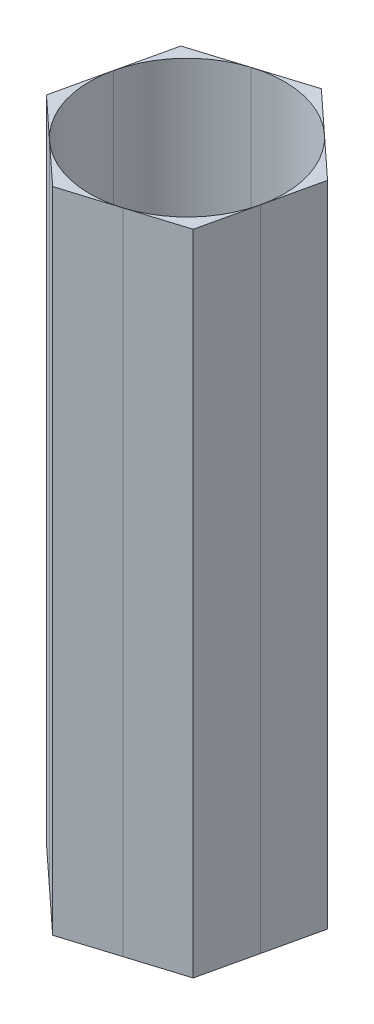
ISO-10303-21;
HEADER;
FILE_DESCRIPTION(('STEP AP214'),'2;1');
FILE_NAME('part.step','',(''),(''),'','','');
FILE_SCHEMA(('AUTOMOTIVE_DESIGN { 1 0 10303 214 1 1 1 1 }'));
ENDSEC;
DATA;
#1=APPLICATION_CONTEXT('core data for automotive mechanical design processes');
#2=APPLICATION_PROTOCOL_DEFINITION('international standard','automotive_design',2000,#1);
#3=PRODUCT_CONTEXT('',#1,'mechanical');
#4=PRODUCT('Part','Part','',(#3));
#5=PRODUCT_RELATED_PRODUCT_CATEGORY('part','',(#4));
#6=PRODUCT_DEFINITION_FORMATION('','',#4);
#7=PRODUCT_DEFINITION_CONTEXT('part definition',#1,'design');
#8=PRODUCT_DEFINITION('design','',#6,#7);
#9=PRODUCT_DEFINITION_SHAPE('','',#8);
#10=(LENGTH_UNIT() NAMED_UNIT(*) SI_UNIT(.MILLI.,.METRE.));
#11=(NAMED_UNIT(*) PLANE_ANGLE_UNIT() SI_UNIT($,.RADIAN.));
#12=(NAMED_UNIT(*) SI_UNIT($,.STERADIAN.) SOLID_ANGLE_UNIT());
#13=UNCERTAINTY_MEASURE_WITH_UNIT(LENGTH_MEASURE(1.E-05),#10,'distance_accuracy_value','');
#14=(GEOMETRIC_REPRESENTATION_CONTEXT(3) GLOBAL_UNCERTAINTY_ASSIGNED_CONTEXT((#13)) GLOBAL_UNIT_ASSIGNED_CONTEXT((#10,
#11,#12)) REPRESENTATION_CONTEXT('',''));
#15=CARTESIAN_POINT('',(0.,0.,0.));
#16=DIRECTION('',(0.,0.,1.));
#17=DIRECTION('',(1.,0.,0.));
#18=AXIS2_PLACEMENT_3D('',#15,#16,#17);
#19=CARTESIAN_POINT('',(-0.382700189937458,10.,1.68924260087823));
#20=DIRECTION('',(-0.296292240203085,0.,-0.955097329278769));
#21=DIRECTION('',(-0.955097329278769,0.,0.296292240203085));
#22=AXIS2_PLACEMENT_3D('',#19,#20,#21);
#23=PLANE('',#22);
#24=DIRECTION('',(0.,1.,0.));
#25=VECTOR('',#24,1.);
#26=CARTESIAN_POINT('',(0.444438782125141,-25.,1.43264735365557));
#27=LINE('',#26,#25);
#28=CARTESIAN_POINT('',(0.44443836030463,0.,1.43264599391816));
#29=VERTEX_POINT('',#28);
#30=CARTESIAN_POINT('',(0.444439203945652,10.,1.43264871339298));
#31=VERTEX_POINT('',#30);
#32=EDGE_CURVE('E54',#29,#31,#27,.T.);
#33=ORIENTED_EDGE('',*,*,#32,.F.);
#34=DIRECTION('',(0.955097329278769,0.,-0.296292240203085));
#35=VECTOR('',#34,1.);
#36=CARTESIAN_POINT('',(-0.382700189937458,0.,1.68924260087823));
#37=LINE('',#36,#35);
#38=CARTESIAN_POINT('',(1.27157691054672,0.,1.17604938695809));
#39=VERTEX_POINT('',#38);
#40=EDGE_CURVE('E92',#29,#39,#37,.T.);
#41=ORIENTED_EDGE('',*,*,#40,.T.);
#42=DIRECTION('',(0.,-1.,0.));
#43=VECTOR('',#42,1.);
#44=CARTESIAN_POINT('',(1.27157691054672,10.,1.17604938695809));
#45=LINE('',#44,#43);
#46=CARTESIAN_POINT('',(1.27157691054672,10.,1.17604938695809));
#47=VERTEX_POINT('',#46);
#48=EDGE_CURVE('E88',#47,#39,#45,.T.);
#49=ORIENTED_EDGE('',*,*,#48,.F.);
#50=DIRECTION('',(0.955097329278769,0.,-0.296292240203085));
#51=VECTOR('',#50,1.);
#52=CARTESIAN_POINT('',(-0.382700189937458,10.,1.68924260087823));
#53=LINE('',#52,#51);
#54=EDGE_CURVE('E48',#31,#47,#53,.T.);
#55=ORIENTED_EDGE('',*,*,#54,.F.);
#56=EDGE_LOOP('',(#33,#41,#49,#55));
#57=FACE_BOUND('',#56,.T.);
#58=ADVANCED_FACE('F44',(#57),#23,.F.);
#59=CARTESIAN_POINT('',(0.,10.,0.));
#60=DIRECTION('',(0.,1.,0.));
#61=DIRECTION('',(0.,0.,1.));
#62=AXIS2_PLACEMENT_3D('',#59,#60,#61);
#63=PLANE('',#62);
#64=CARTESIAN_POINT('',(0.,10.,0.));
#65=DIRECTION('',(0.,1.,0.));
#66=DIRECTION('',(0.,0.,1.));
#67=AXIS2_PLACEMENT_3D('',#64,#65,#66);
#68=CIRCLE('',#67,1.50000284732744);
#69=CARTESIAN_POINT('',(1.46292978247024,10.,0.331428715641823));
#70=VERTEX_POINT('',#69);
#71=EDGE_CURVE('E12',#31,#70,#68,.T.);
#72=ORIENTED_EDGE('',*,*,#71,.F.);
#73=ORIENTED_EDGE('',*,*,#54,.T.);
#74=DIRECTION('',(0.220952057679312,0.,-0.975284670343627));
#75=VECTOR('',#74,1.);
#76=CARTESIAN_POINT('',(1.27157691054672,10.,1.17604938695809));
#77=LINE('',#76,#75);
#78=EDGE_CURVE('E84',#47,#70,#77,.T.);
#79=ORIENTED_EDGE('',*,*,#78,.T.);
#80=EDGE_LOOP('',(#72,#73,#79));
#81=FACE_BOUND('',#80,.T.);
#82=ADVANCED_FACE('F90',(#81),#63,.T.);
#83=CARTESIAN_POINT('',(0.,0.,0.));
#84=DIRECTION('',(0.,1.,0.));
#85=DIRECTION('',(0.,0.,1.));
#86=AXIS2_PLACEMENT_3D('',#83,#84,#85);
#87=PLANE('',#86);
#88=ORIENTED_EDGE('',*,*,#40,.F.);
#89=CARTESIAN_POINT('',(0.,0.,0.));
#90=DIRECTION('',(0.,1.,0.));
#91=DIRECTION('',(0.,0.,1.));
#92=AXIS2_PLACEMENT_3D('',#89,#90,#91);
#93=CIRCLE('',#92,1.50000284732744);
#94=CARTESIAN_POINT('',(1.46292700551545,0.,0.331428086518969));
#95=VERTEX_POINT('',#94);
#96=EDGE_CURVE('E62',#29,#95,#93,.T.);
#97=ORIENTED_EDGE('',*,*,#96,.T.);
#98=DIRECTION('',(0.220952057679312,0.,-0.975284670343627));
#99=VECTOR('',#98,1.);
#100=CARTESIAN_POINT('',(1.27157691054672,0.,1.17604938695809));
#101=LINE('',#100,#99);
#102=EDGE_CURVE('E87',#39,#95,#101,.T.);
#103=ORIENTED_EDGE('',*,*,#102,.F.);
#104=EDGE_LOOP('',(#88,#97,#103));
#105=FACE_BOUND('',#104,.T.);
#106=ADVANCED_FACE('F100',(#105),#87,.F.);
#107=CARTESIAN_POINT('',(1.27157691054672,10.,1.17604938695809));
#108=DIRECTION('',(-0.975284670343628,0.,-0.220952057679312));
#109=DIRECTION('',(-0.220952057679312,0.,0.975284670343628));
#110=AXIS2_PLACEMENT_3D('',#107,#108,#109);
#111=PLANE('',#110);
#112=ORIENTED_EDGE('',*,*,#102,.T.);
#113=DIRECTION('',(0.,1.,0.));
#114=VECTOR('',#113,1.);
#115=CARTESIAN_POINT('',(1.46292839399284,-25.,0.331428401080396));
#116=LINE('',#115,#114);
#117=EDGE_CURVE('E76',#95,#70,#116,.T.);
#118=ORIENTED_EDGE('',*,*,#117,.T.);
#119=ORIENTED_EDGE('',*,*,#78,.F.);
#120=ORIENTED_EDGE('',*,*,#48,.T.);
#121=EDGE_LOOP('',(#112,#118,#119,#120));
#122=FACE_BOUND('',#121,.T.);
#123=ADVANCED_FACE('F82',(#122),#111,.F.);
#124=CARTESIAN_POINT('',(0.,-25.,0.));
#125=DIRECTION('',(0.,1.,0.));
#126=DIRECTION('',(0.,0.,1.));
#127=AXIS2_PLACEMENT_3D('',#124,#125,#126);
#128=CYLINDRICAL_SURFACE('',#127,1.50000284732744);
#129=ORIENTED_EDGE('',*,*,#32,.T.);
#130=ORIENTED_EDGE('',*,*,#71,.T.);
#131=ORIENTED_EDGE('',*,*,#117,.F.);
#132=ORIENTED_EDGE('',*,*,#96,.F.);
#133=EDGE_LOOP('',(#129,#130,#131,#132));
#134=FACE_BOUND('',#133,.T.);
#135=ADVANCED_FACE('F46',(#134),#128,.F.);
#136=CLOSED_SHELL('',(#58,#82,#106,#123,#135));
#137=MANIFOLD_SOLID_BREP('B2',#136);
#138=CARTESIAN_POINT('',(0.,10.,0.));
#139=DIRECTION('',(0.,1.,0.));
#140=DIRECTION('',(0.,0.,1.));
#141=AXIS2_PLACEMENT_3D('',#138,#139,#140);
#142=PLANE('',#141);
#143=CARTESIAN_POINT('',(0.,10.,0.));
#144=DIRECTION('',(0.,1.,0.));
#145=DIRECTION('',(0.,0.,1.));
#146=AXIS2_PLACEMENT_3D('',#143,#144,#145);
#147=CIRCLE('',#146,1.50000284732744);
#148=CARTESIAN_POINT('',(-1.01849057852459,10.,1.10121999775116));
#149=VERTEX_POINT('',#148);
#150=CARTESIAN_POINT('',(0.444439203945652,10.,1.43264871339298));
#151=VERTEX_POINT('',#150);
#152=EDGE_CURVE('E42',#149,#151,#147,.T.);
#153=ORIENTED_EDGE('',*,*,#152,.F.);
#154=DIRECTION('',(0.734145271599457,0.,0.678992430140542));
#155=VECTOR('',#154,1.);
#156=CARTESIAN_POINT('',(-1.65427710048418,10.,0.513193213920148));
#157=LINE('',#156,#155);
#158=CARTESIAN_POINT('',(-0.382700189937458,10.,1.68924260087823));
#159=VERTEX_POINT('',#158);
#160=EDGE_CURVE('E194',#149,#159,#157,.T.);
#161=ORIENTED_EDGE('',*,*,#160,.T.);
#162=DIRECTION('',(0.955097329278769,0.,-0.296292240203085));
#163=VECTOR('',#162,1.);
#164=CARTESIAN_POINT('',(-0.382700189937458,10.,1.68924260087823));
#165=LINE('',#164,#163);
#166=EDGE_CURVE('E190',#159,#151,#165,.T.);
#167=ORIENTED_EDGE('',*,*,#166,.T.);
#168=EDGE_LOOP('',(#153,#161,#167));
#169=FACE_BOUND('',#168,.T.);
#170=ADVANCED_FACE('F152',(#169),#142,.T.);
#171=CARTESIAN_POINT('',(0.,0.,0.));
#172=DIRECTION('',(0.,1.,0.));
#173=DIRECTION('',(0.,0.,1.));
#174=AXIS2_PLACEMENT_3D('',#171,#172,#173);
#175=PLANE('',#174);
#176=DIRECTION('',(0.734145271599457,0.,0.678992430140542));
#177=VECTOR('',#176,1.);
#178=CARTESIAN_POINT('',(-1.65427710048418,0.,0.513193213920148));
#179=LINE('',#178,#177);
#180=CARTESIAN_POINT('',(-1.01848864521082,0.,1.10121790739919));
#181=VERTEX_POINT('',#180);
#182=CARTESIAN_POINT('',(-0.382700189937458,0.,1.68924260087823));
#183=VERTEX_POINT('',#182);
#184=EDGE_CURVE('E197',#181,#183,#179,.T.);
#185=ORIENTED_EDGE('',*,*,#184,.F.);
#186=CARTESIAN_POINT('',(0.,0.,0.));
#187=DIRECTION('',(0.,1.,0.));
#188=DIRECTION('',(0.,0.,1.));
#189=AXIS2_PLACEMENT_3D('',#186,#187,#188);
#190=CIRCLE('',#189,1.50000284732744);
#191=CARTESIAN_POINT('',(0.44443836030463,0.,1.43264599391816));
#192=VERTEX_POINT('',#191);
#193=EDGE_CURVE('E169',#181,#192,#190,.T.);
#194=ORIENTED_EDGE('',*,*,#193,.T.);
#195=DIRECTION('',(0.955097329278769,0.,-0.296292240203085));
#196=VECTOR('',#195,1.);
#197=CARTESIAN_POINT('',(-0.382700189937458,0.,1.68924260087823));
#198=LINE('',#197,#196);
#199=EDGE_CURVE('E192',#183,#192,#198,.T.);
#200=ORIENTED_EDGE('',*,*,#199,.F.);
#201=EDGE_LOOP('',(#185,#194,#200));
#202=FACE_BOUND('',#201,.T.);
#203=ADVANCED_FACE('F208',(#202),#175,.F.);
#204=CARTESIAN_POINT('',(-1.65427710048418,10.,0.513193213920148));
#205=DIRECTION('',(0.678992430140542,0.,-0.734145271599457));
#206=DIRECTION('',(-0.734145271599457,0.,-0.678992430140542));
#207=AXIS2_PLACEMENT_3D('',#204,#205,#206);
#208=PLANE('',#207);
#209=DIRECTION('',(0.,1.,0.));
#210=VECTOR('',#209,1.);
#211=CARTESIAN_POINT('',(-1.0184896118677,-25.,1.10121895257517));
#212=LINE('',#211,#210);
#213=EDGE_CURVE('E162',#181,#149,#212,.T.);
#214=ORIENTED_EDGE('',*,*,#213,.F.);
#215=ORIENTED_EDGE('',*,*,#184,.T.);
#216=DIRECTION('',(0.,-1.,0.));
#217=VECTOR('',#216,1.);
#218=CARTESIAN_POINT('',(-0.382700189937458,10.,1.68924260087823));
#219=LINE('',#218,#217);
#220=EDGE_CURVE('E193',#159,#183,#219,.T.);
#221=ORIENTED_EDGE('',*,*,#220,.F.);
#222=ORIENTED_EDGE('',*,*,#160,.F.);
#223=EDGE_LOOP('',(#214,#215,#221,#222));
#224=FACE_BOUND('',#223,.T.);
#225=ADVANCED_FACE('F206',(#224),#208,.F.);
#226=CARTESIAN_POINT('',(-0.382700189937458,10.,1.68924260087823));
#227=DIRECTION('',(-0.296292240203085,0.,-0.955097329278769));
#228=DIRECTION('',(-0.955097329278769,0.,0.296292240203085));
#229=AXIS2_PLACEMENT_3D('',#226,#227,#228);
#230=PLANE('',#229);
#231=ORIENTED_EDGE('',*,*,#199,.T.);
#232=DIRECTION('',(0.,1.,0.));
#233=VECTOR('',#232,1.);
#234=CARTESIAN_POINT('',(0.444438782125141,-25.,1.43264735365557));
#235=LINE('',#234,#233);
#236=EDGE_CURVE('E156',#192,#151,#235,.T.);
#237=ORIENTED_EDGE('',*,*,#236,.T.);
#238=ORIENTED_EDGE('',*,*,#166,.F.);
#239=ORIENTED_EDGE('',*,*,#220,.T.);
#240=EDGE_LOOP('',(#231,#237,#238,#239));
#241=FACE_BOUND('',#240,.T.);
#242=ADVANCED_FACE('F188',(#241),#230,.F.);
#243=CARTESIAN_POINT('',(0.,-25.,0.));
#244=DIRECTION('',(0.,1.,0.));
#245=DIRECTION('',(0.,0.,1.));
#246=AXIS2_PLACEMENT_3D('',#243,#244,#245);
#247=CYLINDRICAL_SURFACE('',#246,1.50000284732744);
#248=ORIENTED_EDGE('',*,*,#213,.T.);
#249=ORIENTED_EDGE('',*,*,#152,.T.);
#250=ORIENTED_EDGE('',*,*,#236,.F.);
#251=ORIENTED_EDGE('',*,*,#193,.F.);
#252=EDGE_LOOP('',(#248,#249,#250,#251));
#253=FACE_BOUND('',#252,.T.);
#254=ADVANCED_FACE('F154',(#253),#247,.F.);
#255=CLOSED_SHELL('',(#170,#203,#225,#242,#254));
#256=MANIFOLD_SOLID_BREP('B6',#255);
#257=CARTESIAN_POINT('',(0.,10.,0.));
#258=DIRECTION('',(0.,1.,0.));
#259=DIRECTION('',(0.,0.,1.));
#260=AXIS2_PLACEMENT_3D('',#257,#258,#259);
#261=PLANE('',#260);
#262=CARTESIAN_POINT('',(0.,10.,0.));
#263=DIRECTION('',(0.,1.,0.));
#264=DIRECTION('',(0.,0.,1.));
#265=AXIS2_PLACEMENT_3D('',#262,#263,#264);
#266=CIRCLE('',#265,1.50000284732744);
#267=CARTESIAN_POINT('',(-1.46292978247024,10.,-0.331428715641823));
#268=VERTEX_POINT('',#267);
#269=CARTESIAN_POINT('',(-1.01849057852459,10.,1.10121999775116));
#270=VERTEX_POINT('',#269);
#271=EDGE_CURVE('E150',#268,#270,#266,.T.);
#272=ORIENTED_EDGE('',*,*,#271,.F.);
#273=DIRECTION('',(-0.220952057679311,0.,0.975284670343628));
#274=VECTOR('',#273,1.);
#275=CARTESIAN_POINT('',(-1.27157691054672,10.,-1.17604938695809));
#276=LINE('',#275,#274);
#277=CARTESIAN_POINT('',(-1.65427710048418,10.,0.513193213920148));
#278=VERTEX_POINT('',#277);
#279=EDGE_CURVE('E303',#268,#278,#276,.T.);
#280=ORIENTED_EDGE('',*,*,#279,.T.);
#281=DIRECTION('',(0.734145271599457,0.,0.678992430140542));
#282=VECTOR('',#281,1.);
#283=CARTESIAN_POINT('',(-1.65427710048418,10.,0.513193213920148));
#284=LINE('',#283,#282);
#285=EDGE_CURVE('E298',#278,#270,#284,.T.);
#286=ORIENTED_EDGE('',*,*,#285,.T.);
#287=EDGE_LOOP('',(#272,#280,#286));
#288=FACE_BOUND('',#287,.T.);
#289=ADVANCED_FACE('F260',(#288),#261,.T.);
#290=CARTESIAN_POINT('',(0.,0.,0.));
#291=DIRECTION('',(0.,1.,0.));
#292=DIRECTION('',(0.,0.,1.));
#293=AXIS2_PLACEMENT_3D('',#290,#291,#292);
#294=PLANE('',#293);
#295=DIRECTION('',(-0.220952057679311,0.,0.975284670343628));
#296=VECTOR('',#295,1.);
#297=CARTESIAN_POINT('',(-1.27157691054672,0.,-1.17604938695809));
#298=LINE('',#297,#296);
#299=CARTESIAN_POINT('',(-1.46292700551545,0.,-0.331428086518968));
#300=VERTEX_POINT('',#299);
#301=CARTESIAN_POINT('',(-1.65427710048418,0.,0.513193213920148));
#302=VERTEX_POINT('',#301);
#303=EDGE_CURVE('E311',#300,#302,#298,.T.);
#304=ORIENTED_EDGE('',*,*,#303,.F.);
#305=CARTESIAN_POINT('',(0.,0.,0.));
#306=DIRECTION('',(0.,1.,0.));
#307=DIRECTION('',(0.,0.,1.));
#308=AXIS2_PLACEMENT_3D('',#305,#306,#307);
#309=CIRCLE('',#308,1.50000284732744);
#310=CARTESIAN_POINT('',(-1.01848864521082,0.,1.10121790739919));
#311=VERTEX_POINT('',#310);
#312=EDGE_CURVE('E264',#300,#311,#309,.T.);
#313=ORIENTED_EDGE('',*,*,#312,.T.);
#314=DIRECTION('',(0.734145271599457,0.,0.678992430140542));
#315=VECTOR('',#314,1.);
#316=CARTESIAN_POINT('',(-1.65427710048418,0.,0.513193213920148));
#317=LINE('',#316,#315);
#318=EDGE_CURVE('E300',#302,#311,#317,.T.);
#319=ORIENTED_EDGE('',*,*,#318,.F.);
#320=EDGE_LOOP('',(#304,#313,#319));
#321=FACE_BOUND('',#320,.T.);
#322=ADVANCED_FACE('F315',(#321),#294,.F.);
#323=CARTESIAN_POINT('',(-1.65427710048418,10.,0.513193213920148));
#324=DIRECTION('',(0.678992430140542,0.,-0.734145271599457));
#325=DIRECTION('',(-0.734145271599457,0.,-0.678992430140542));
#326=AXIS2_PLACEMENT_3D('',#323,#324,#325);
#327=PLANE('',#326);
#328=ORIENTED_EDGE('',*,*,#318,.T.);
#329=DIRECTION('',(0.,1.,0.));
#330=VECTOR('',#329,1.);
#331=CARTESIAN_POINT('',(-1.0184896118677,-25.,1.10121895257517));
#332=LINE('',#331,#330);
#333=EDGE_CURVE('E290',#311,#270,#332,.T.);
#334=ORIENTED_EDGE('',*,*,#333,.T.);
#335=ORIENTED_EDGE('',*,*,#285,.F.);
#336=DIRECTION('',(0.,-1.,0.));
#337=VECTOR('',#336,1.);
#338=CARTESIAN_POINT('',(-1.65427710048418,10.,0.513193213920148));
#339=LINE('',#338,#337);
#340=EDGE_CURVE('E301',#278,#302,#339,.T.);
#341=ORIENTED_EDGE('',*,*,#340,.T.);
#342=EDGE_LOOP('',(#328,#334,#335,#341));
#343=FACE_BOUND('',#342,.T.);
#344=ADVANCED_FACE('F296',(#343),#327,.F.);
#345=CARTESIAN_POINT('',(-1.27157691054672,10.,-1.17604938695809));
#346=DIRECTION('',(0.975284670343628,0.,0.220952057679311));
#347=DIRECTION('',(0.220952057679311,0.,-0.975284670343628));
#348=AXIS2_PLACEMENT_3D('',#345,#346,#347);
#349=PLANE('',#348);
#350=DIRECTION('',(0.,1.,0.));
#351=VECTOR('',#350,1.);
#352=CARTESIAN_POINT('',(-1.46292839399284,-25.,-0.331428401080395));
#353=LINE('',#352,#351);
#354=EDGE_CURVE('E270',#300,#268,#353,.T.);
#355=ORIENTED_EDGE('',*,*,#354,.F.);
#356=ORIENTED_EDGE('',*,*,#303,.T.);
#357=ORIENTED_EDGE('',*,*,#340,.F.);
#358=ORIENTED_EDGE('',*,*,#279,.F.);
#359=EDGE_LOOP('',(#355,#356,#357,#358));
#360=FACE_BOUND('',#359,.T.);
#361=ADVANCED_FACE('F321',(#360),#349,.F.);
#362=CARTESIAN_POINT('',(0.,-25.,0.));
#363=DIRECTION('',(0.,1.,0.));
#364=DIRECTION('',(0.,0.,1.));
#365=AXIS2_PLACEMENT_3D('',#362,#363,#364);
#366=CYLINDRICAL_SURFACE('',#365,1.50000284732744);
#367=ORIENTED_EDGE('',*,*,#354,.T.);
#368=ORIENTED_EDGE('',*,*,#271,.T.);
#369=ORIENTED_EDGE('',*,*,#333,.F.);
#370=ORIENTED_EDGE('',*,*,#312,.F.);
#371=EDGE_LOOP('',(#367,#368,#369,#370));
#372=FACE_BOUND('',#371,.T.);
#373=ADVANCED_FACE('F262',(#372),#366,.F.);
#374=CLOSED_SHELL('',(#289,#322,#344,#361,#373));
#375=MANIFOLD_SOLID_BREP('B36',#374);
#376=CARTESIAN_POINT('',(0.,10.,0.));
#377=DIRECTION('',(0.,1.,0.));
#378=DIRECTION('',(0.,0.,1.));
#379=AXIS2_PLACEMENT_3D('',#376,#377,#378);
#380=PLANE('',#379);
#381=CARTESIAN_POINT('',(0.,10.,0.));
#382=DIRECTION('',(0.,1.,0.));
#383=DIRECTION('',(0.,0.,1.));
#384=AXIS2_PLACEMENT_3D('',#381,#382,#383);
#385=CIRCLE('',#384,1.50000284732744);
#386=CARTESIAN_POINT('',(-0.444439203945652,10.,-1.43264871339298));
#387=VERTEX_POINT('',#386);
#388=CARTESIAN_POINT('',(-1.46292978247024,10.,-0.331428715641823));
#389=VERTEX_POINT('',#388);
#390=EDGE_CURVE('E258',#387,#389,#385,.T.);
#391=ORIENTED_EDGE('',*,*,#390,.F.);
#392=DIRECTION('',(-0.955097329278769,0.,0.296292240203085));
#393=VECTOR('',#392,1.);
#394=CARTESIAN_POINT('',(0.382700189937459,10.,-1.68924260087823));
#395=LINE('',#394,#393);
#396=CARTESIAN_POINT('',(-1.27157691054672,10.,-1.17604938695809));
#397=VERTEX_POINT('',#396);
#398=EDGE_CURVE('E411',#387,#397,#395,.T.);
#399=ORIENTED_EDGE('',*,*,#398,.T.);
#400=DIRECTION('',(-0.220952057679311,0.,0.975284670343628));
#401=VECTOR('',#400,1.);
#402=CARTESIAN_POINT('',(-1.27157691054672,10.,-1.17604938695809));
#403=LINE('',#402,#401);
#404=EDGE_CURVE('E406',#397,#389,#403,.T.);
#405=ORIENTED_EDGE('',*,*,#404,.T.);
#406=EDGE_LOOP('',(#391,#399,#405));
#407=FACE_BOUND('',#406,.T.);
#408=ADVANCED_FACE('F368',(#407),#380,.T.);
#409=CARTESIAN_POINT('',(0.,0.,0.));
#410=DIRECTION('',(0.,1.,0.));
#411=DIRECTION('',(0.,0.,1.));
#412=AXIS2_PLACEMENT_3D('',#409,#410,#411);
#413=PLANE('',#412);
#414=DIRECTION('',(-0.955097329278769,0.,0.296292240203085));
#415=VECTOR('',#414,1.);
#416=CARTESIAN_POINT('',(0.382700189937459,0.,-1.68924260087823));
#417=LINE('',#416,#415);
#418=CARTESIAN_POINT('',(-0.44443836030463,0.,-1.43264599391816));
#419=VERTEX_POINT('',#418);
#420=CARTESIAN_POINT('',(-1.27157691054672,0.,-1.17604938695809));
#421=VERTEX_POINT('',#420);
#422=EDGE_CURVE('E419',#419,#421,#417,.T.);
#423=ORIENTED_EDGE('',*,*,#422,.F.);
#424=CARTESIAN_POINT('',(0.,0.,0.));
#425=DIRECTION('',(0.,1.,0.));
#426=DIRECTION('',(0.,0.,1.));
#427=AXIS2_PLACEMENT_3D('',#424,#425,#426);
#428=CIRCLE('',#427,1.50000284732744);
#429=CARTESIAN_POINT('',(-1.46292700551545,0.,-0.331428086518968));
#430=VERTEX_POINT('',#429);
#431=EDGE_CURVE('E372',#419,#430,#428,.T.);
#432=ORIENTED_EDGE('',*,*,#431,.T.);
#433=DIRECTION('',(-0.220952057679311,0.,0.975284670343628));
#434=VECTOR('',#433,1.);
#435=CARTESIAN_POINT('',(-1.27157691054672,0.,-1.17604938695809));
#436=LINE('',#435,#434);
#437=EDGE_CURVE('E408',#421,#430,#436,.T.);
#438=ORIENTED_EDGE('',*,*,#437,.F.);
#439=EDGE_LOOP('',(#423,#432,#438));
#440=FACE_BOUND('',#439,.T.);
#441=ADVANCED_FACE('F423',(#440),#413,.F.);
#442=CARTESIAN_POINT('',(-1.27157691054672,10.,-1.17604938695809));
#443=DIRECTION('',(0.975284670343628,0.,0.220952057679311));
#444=DIRECTION('',(0.220952057679311,0.,-0.975284670343628));
#445=AXIS2_PLACEMENT_3D('',#442,#443,#444);
#446=PLANE('',#445);
#447=ORIENTED_EDGE('',*,*,#437,.T.);
#448=DIRECTION('',(0.,1.,0.));
#449=VECTOR('',#448,1.);
#450=CARTESIAN_POINT('',(-1.46292839399284,-25.,-0.331428401080395));
#451=LINE('',#450,#449);
#452=EDGE_CURVE('E398',#430,#389,#451,.T.);
#453=ORIENTED_EDGE('',*,*,#452,.T.);
#454=ORIENTED_EDGE('',*,*,#404,.F.);
#455=DIRECTION('',(0.,-1.,0.));
#456=VECTOR('',#455,1.);
#457=CARTESIAN_POINT('',(-1.27157691054672,10.,-1.17604938695809));
#458=LINE('',#457,#456);
#459=EDGE_CURVE('E409',#397,#421,#458,.T.);
#460=ORIENTED_EDGE('',*,*,#459,.T.);
#461=EDGE_LOOP('',(#447,#453,#454,#460));
#462=FACE_BOUND('',#461,.T.);
#463=ADVANCED_FACE('F404',(#462),#446,.F.);
#464=CARTESIAN_POINT('',(0.382700189937459,10.,-1.68924260087823));
#465=DIRECTION('',(0.296292240203085,0.,0.955097329278769));
#466=DIRECTION('',(0.955097329278769,0.,-0.296292240203085));
#467=AXIS2_PLACEMENT_3D('',#464,#465,#466);
#468=PLANE('',#467);
#469=DIRECTION('',(0.,1.,0.));
#470=VECTOR('',#469,1.);
#471=CARTESIAN_POINT('',(-0.444438782125141,-25.,-1.43264735365557));
#472=LINE('',#471,#470);
#473=EDGE_CURVE('E378',#419,#387,#472,.T.);
#474=ORIENTED_EDGE('',*,*,#473,.F.);
#475=ORIENTED_EDGE('',*,*,#422,.T.);
#476=ORIENTED_EDGE('',*,*,#459,.F.);
#477=ORIENTED_EDGE('',*,*,#398,.F.);
#478=EDGE_LOOP('',(#474,#475,#476,#477));
#479=FACE_BOUND('',#478,.T.);
#480=ADVANCED_FACE('F429',(#479),#468,.F.);
#481=CARTESIAN_POINT('',(0.,-25.,0.));
#482=DIRECTION('',(0.,1.,0.));
#483=DIRECTION('',(0.,0.,1.));
#484=AXIS2_PLACEMENT_3D('',#481,#482,#483);
#485=CYLINDRICAL_SURFACE('',#484,1.50000284732744);
#486=ORIENTED_EDGE('',*,*,#473,.T.);
#487=ORIENTED_EDGE('',*,*,#390,.T.);
#488=ORIENTED_EDGE('',*,*,#452,.F.);
#489=ORIENTED_EDGE('',*,*,#431,.F.);
#490=EDGE_LOOP('',(#486,#487,#488,#489));
#491=FACE_BOUND('',#490,.T.);
#492=ADVANCED_FACE('F370',(#491),#485,.F.);
#493=CLOSED_SHELL('',(#408,#441,#463,#480,#492));
#494=MANIFOLD_SOLID_BREP('B144',#493);
#495=CARTESIAN_POINT('',(0.,10.,0.));
#496=DIRECTION('',(0.,1.,0.));
#497=DIRECTION('',(0.,0.,1.));
#498=AXIS2_PLACEMENT_3D('',#495,#496,#497);
#499=PLANE('',#498);
#500=CARTESIAN_POINT('',(0.,10.,0.));
#501=DIRECTION('',(0.,1.,0.));
#502=DIRECTION('',(0.,0.,1.));
#503=AXIS2_PLACEMENT_3D('',#500,#501,#502);
#504=CIRCLE('',#503,1.50000284732744);
#505=CARTESIAN_POINT('',(1.01849057852459,10.,-1.10121999775116));
#506=VERTEX_POINT('',#505);
#507=CARTESIAN_POINT('',(-0.444439203945652,10.,-1.43264871339298));
#508=VERTEX_POINT('',#507);
#509=EDGE_CURVE('E366',#506,#508,#504,.T.);
#510=ORIENTED_EDGE('',*,*,#509,.F.);
#511=DIRECTION('',(-0.734145271599457,0.,-0.678992430140542));
#512=VECTOR('',#511,1.);
#513=CARTESIAN_POINT('',(1.65427710048418,10.,-0.513193213920148));
#514=LINE('',#513,#512);
#515=CARTESIAN_POINT('',(0.382700189937459,10.,-1.68924260087823));
#516=VERTEX_POINT('',#515);
#517=EDGE_CURVE('E519',#506,#516,#514,.T.);
#518=ORIENTED_EDGE('',*,*,#517,.T.);
#519=DIRECTION('',(-0.955097329278769,0.,0.296292240203085));
#520=VECTOR('',#519,1.);
#521=CARTESIAN_POINT('',(0.382700189937459,10.,-1.68924260087823));
#522=LINE('',#521,#520);
#523=EDGE_CURVE('E514',#516,#508,#522,.T.);
#524=ORIENTED_EDGE('',*,*,#523,.T.);
#525=EDGE_LOOP('',(#510,#518,#524));
#526=FACE_BOUND('',#525,.T.);
#527=ADVANCED_FACE('F475',(#526),#499,.T.);
#528=CARTESIAN_POINT('',(0.,0.,0.));
#529=DIRECTION('',(0.,1.,0.));
#530=DIRECTION('',(0.,0.,1.));
#531=AXIS2_PLACEMENT_3D('',#528,#529,#530);
#532=PLANE('',#531);
#533=DIRECTION('',(-0.734145271599457,0.,-0.678992430140542));
#534=VECTOR('',#533,1.);
#535=CARTESIAN_POINT('',(1.65427710048418,0.,-0.513193213920148));
#536=LINE('',#535,#534);
#537=CARTESIAN_POINT('',(1.01848864521082,0.,-1.10121790739919));
#538=VERTEX_POINT('',#537);
#539=CARTESIAN_POINT('',(0.382700189937459,0.,-1.68924260087823));
#540=VERTEX_POINT('',#539);
#541=EDGE_CURVE('E526',#538,#540,#536,.T.);
#542=ORIENTED_EDGE('',*,*,#541,.F.);
#543=CARTESIAN_POINT('',(0.,0.,0.));
#544=DIRECTION('',(0.,1.,0.));
#545=DIRECTION('',(0.,0.,1.));
#546=AXIS2_PLACEMENT_3D('',#543,#544,#545);
#547=CIRCLE('',#546,1.50000284732744);
#548=CARTESIAN_POINT('',(-0.44443836030463,0.,-1.43264599391816));
#549=VERTEX_POINT('',#548);
#550=EDGE_CURVE('E479',#538,#549,#547,.T.);
#551=ORIENTED_EDGE('',*,*,#550,.T.);
#552=DIRECTION('',(-0.955097329278769,0.,0.296292240203085));
#553=VECTOR('',#552,1.);
#554=CARTESIAN_POINT('',(0.382700189937459,0.,-1.68924260087823));
#555=LINE('',#554,#553);
#556=EDGE_CURVE('E516',#540,#549,#555,.T.);
#557=ORIENTED_EDGE('',*,*,#556,.F.);
#558=EDGE_LOOP('',(#542,#551,#557));
#559=FACE_BOUND('',#558,.T.);
#560=ADVANCED_FACE('F477',(#559),#532,.F.);
#561=CARTESIAN_POINT('',(0.382700189937459,10.,-1.68924260087823));
#562=DIRECTION('',(0.296292240203085,0.,0.955097329278769));
#563=DIRECTION('',(0.955097329278769,0.,-0.296292240203085));
#564=AXIS2_PLACEMENT_3D('',#561,#562,#563);
#565=PLANE('',#564);
#566=ORIENTED_EDGE('',*,*,#556,.T.);
#567=DIRECTION('',(0.,1.,0.));
#568=VECTOR('',#567,1.);
#569=CARTESIAN_POINT('',(-0.444438782125141,-25.,-1.43264735365557));
#570=LINE('',#569,#568);
#571=EDGE_CURVE('E506',#549,#508,#570,.T.);
#572=ORIENTED_EDGE('',*,*,#571,.T.);
#573=ORIENTED_EDGE('',*,*,#523,.F.);
#574=DIRECTION('',(0.,-1.,0.));
#575=VECTOR('',#574,1.);
#576=CARTESIAN_POINT('',(0.382700189937459,10.,-1.68924260087823));
#577=LINE('',#576,#575);
#578=EDGE_CURVE('E517',#516,#540,#577,.T.);
#579=ORIENTED_EDGE('',*,*,#578,.T.);
#580=EDGE_LOOP('',(#566,#572,#573,#579));
#581=FACE_BOUND('',#580,.T.);
#582=ADVANCED_FACE('F512',(#581),#565,.F.);
#583=CARTESIAN_POINT('',(1.65427710048418,10.,-0.513193213920148));
#584=DIRECTION('',(-0.678992430140542,0.,0.734145271599457));
#585=DIRECTION('',(0.734145271599457,0.,0.678992430140542));
#586=AXIS2_PLACEMENT_3D('',#583,#584,#585);
#587=PLANE('',#586);
#588=DIRECTION('',(0.,1.,0.));
#589=VECTOR('',#588,1.);
#590=CARTESIAN_POINT('',(1.0184896118677,-25.,-1.10121895257517));
#591=LINE('',#590,#589);
#592=EDGE_CURVE('E485',#538,#506,#591,.T.);
#593=ORIENTED_EDGE('',*,*,#592,.F.);
#594=ORIENTED_EDGE('',*,*,#541,.T.);
#595=ORIENTED_EDGE('',*,*,#578,.F.);
#596=ORIENTED_EDGE('',*,*,#517,.F.);
#597=EDGE_LOOP('',(#593,#594,#595,#596));
#598=FACE_BOUND('',#597,.T.);
#599=ADVANCED_FACE('F536',(#598),#587,.F.);
#600=CARTESIAN_POINT('',(0.,-25.,0.));
#601=DIRECTION('',(0.,1.,0.));
#602=DIRECTION('',(0.,0.,1.));
#603=AXIS2_PLACEMENT_3D('',#600,#601,#602);
#604=CYLINDRICAL_SURFACE('',#603,1.50000284732744);
#605=ORIENTED_EDGE('',*,*,#592,.T.);
#606=ORIENTED_EDGE('',*,*,#509,.T.);
#607=ORIENTED_EDGE('',*,*,#571,.F.);
#608=ORIENTED_EDGE('',*,*,#550,.F.);
#609=EDGE_LOOP('',(#605,#606,#607,#608));
#610=FACE_BOUND('',#609,.T.);
#611=ADVANCED_FACE('F505',(#610),#604,.F.);
#612=CLOSED_SHELL('',(#527,#560,#582,#599,#611));
#613=MANIFOLD_SOLID_BREP('B252',#612);
#614=CARTESIAN_POINT('',(0.,10.,0.));
#615=DIRECTION('',(0.,1.,0.));
#616=DIRECTION('',(0.,0.,1.));
#617=AXIS2_PLACEMENT_3D('',#614,#615,#616);
#618=PLANE('',#617);
#619=CARTESIAN_POINT('',(0.,10.,0.));
#620=DIRECTION('',(0.,1.,0.));
#621=DIRECTION('',(0.,0.,1.));
#622=AXIS2_PLACEMENT_3D('',#619,#620,#621);
#623=CIRCLE('',#622,1.50000284732744);
#624=CARTESIAN_POINT('',(1.46292978247024,10.,0.331428715641823));
#625=VERTEX_POINT('',#624);
#626=CARTESIAN_POINT('',(1.01849057852459,10.,-1.10121999775116));
#627=VERTEX_POINT('',#626);
#628=EDGE_CURVE('E604',#625,#627,#623,.T.);
#629=ORIENTED_EDGE('',*,*,#628,.F.);
#630=DIRECTION('',(0.220952057679312,0.,-0.975284670343627));
#631=VECTOR('',#630,1.);
#632=CARTESIAN_POINT('',(1.27157691054672,10.,1.17604938695809));
#633=LINE('',#632,#631);
#634=CARTESIAN_POINT('',(1.65427710048418,10.,-0.513193213920148));
#635=VERTEX_POINT('',#634);
#636=EDGE_CURVE('E619',#625,#635,#633,.T.);
#637=ORIENTED_EDGE('',*,*,#636,.T.);
#638=DIRECTION('',(-0.734145271599457,0.,-0.678992430140542));
#639=VECTOR('',#638,1.);
#640=CARTESIAN_POINT('',(1.65427710048418,10.,-0.513193213920148));
#641=LINE('',#640,#639);
#642=EDGE_CURVE('E613',#635,#627,#641,.T.);
#643=ORIENTED_EDGE('',*,*,#642,.T.);
#644=EDGE_LOOP('',(#629,#637,#643));
#645=FACE_BOUND('',#644,.T.);
#646=ADVANCED_FACE('F573',(#645),#618,.T.);
#647=CARTESIAN_POINT('',(0.,0.,0.));
#648=DIRECTION('',(0.,1.,0.));
#649=DIRECTION('',(0.,0.,1.));
#650=AXIS2_PLACEMENT_3D('',#647,#648,#649);
#651=PLANE('',#650);
#652=DIRECTION('',(0.220952057679312,0.,-0.975284670343627));
#653=VECTOR('',#652,1.);
#654=CARTESIAN_POINT('',(1.27157691054672,0.,1.17604938695809));
#655=LINE('',#654,#653);
#656=CARTESIAN_POINT('',(1.46292700551545,0.,0.331428086518969));
#657=VERTEX_POINT('',#656);
#658=CARTESIAN_POINT('',(1.65427710048418,0.,-0.513193213920148));
#659=VERTEX_POINT('',#658);
#660=EDGE_CURVE('E617',#657,#659,#655,.T.);
#661=ORIENTED_EDGE('',*,*,#660,.F.);
#662=CARTESIAN_POINT('',(0.,0.,0.));
#663=DIRECTION('',(0.,1.,0.));
#664=DIRECTION('',(0.,0.,1.));
#665=AXIS2_PLACEMENT_3D('',#662,#663,#664);
#666=CIRCLE('',#665,1.50000284732744);
#667=CARTESIAN_POINT('',(1.01848864521082,0.,-1.10121790739919));
#668=VERTEX_POINT('',#667);
#669=EDGE_CURVE('E577',#657,#668,#666,.T.);
#670=ORIENTED_EDGE('',*,*,#669,.T.);
#671=DIRECTION('',(-0.734145271599457,0.,-0.678992430140542));
#672=VECTOR('',#671,1.);
#673=CARTESIAN_POINT('',(1.65427710048418,0.,-0.513193213920148));
#674=LINE('',#673,#672);
#675=EDGE_CURVE('E615',#659,#668,#674,.T.);
#676=ORIENTED_EDGE('',*,*,#675,.F.);
#677=EDGE_LOOP('',(#661,#670,#676));
#678=FACE_BOUND('',#677,.T.);
#679=ADVANCED_FACE('F629',(#678),#651,.F.);
#680=CARTESIAN_POINT('',(1.65427710048418,10.,-0.513193213920148));
#681=DIRECTION('',(-0.678992430140542,0.,0.734145271599457));
#682=DIRECTION('',(0.734145271599457,0.,0.678992430140542));
#683=AXIS2_PLACEMENT_3D('',#680,#681,#682);
#684=PLANE('',#683);
#685=ORIENTED_EDGE('',*,*,#675,.T.);
#686=DIRECTION('',(0.,1.,0.));
#687=VECTOR('',#686,1.);
#688=CARTESIAN_POINT('',(1.0184896118677,-25.,-1.10121895257517));
#689=LINE('',#688,#687);
#690=EDGE_CURVE('E592',#668,#627,#689,.T.);
#691=ORIENTED_EDGE('',*,*,#690,.T.);
#692=ORIENTED_EDGE('',*,*,#642,.F.);
#693=DIRECTION('',(0.,-1.,0.));
#694=VECTOR('',#693,1.);
#695=CARTESIAN_POINT('',(1.65427710048418,10.,-0.513193213920148));
#696=LINE('',#695,#694);
#697=EDGE_CURVE('E621',#635,#659,#696,.T.);
#698=ORIENTED_EDGE('',*,*,#697,.T.);
#699=EDGE_LOOP('',(#685,#691,#692,#698));
#700=FACE_BOUND('',#699,.T.);
#701=ADVANCED_FACE('F611',(#700),#684,.F.);
#702=CARTESIAN_POINT('',(1.27157691054672,10.,1.17604938695809));
#703=DIRECTION('',(-0.975284670343628,0.,-0.220952057679312));
#704=DIRECTION('',(-0.220952057679312,0.,0.975284670343628));
#705=AXIS2_PLACEMENT_3D('',#702,#703,#704);
#706=PLANE('',#705);
#707=DIRECTION('',(0.,1.,0.));
#708=VECTOR('',#707,1.);
#709=CARTESIAN_POINT('',(1.46292839399284,-25.,0.331428401080396));
#710=LINE('',#709,#708);
#711=EDGE_CURVE('E473',#657,#625,#710,.T.);
#712=ORIENTED_EDGE('',*,*,#711,.F.);
#713=ORIENTED_EDGE('',*,*,#660,.T.);
#714=ORIENTED_EDGE('',*,*,#697,.F.);
#715=ORIENTED_EDGE('',*,*,#636,.F.);
#716=EDGE_LOOP('',(#712,#713,#714,#715));
#717=FACE_BOUND('',#716,.T.);
#718=ADVANCED_FACE('F575',(#717),#706,.F.);
#719=CARTESIAN_POINT('',(0.,-25.,0.));
#720=DIRECTION('',(0.,1.,0.));
#721=DIRECTION('',(0.,0.,1.));
#722=AXIS2_PLACEMENT_3D('',#719,#720,#721);
#723=CYLINDRICAL_SURFACE('',#722,1.50000284732744);
#724=ORIENTED_EDGE('',*,*,#669,.F.);
#725=ORIENTED_EDGE('',*,*,#711,.T.);
#726=ORIENTED_EDGE('',*,*,#628,.T.);
#727=ORIENTED_EDGE('',*,*,#690,.F.);
#728=EDGE_LOOP('',(#724,#725,#726,#727));
#729=FACE_BOUND('',#728,.T.);
#730=ADVANCED_FACE('F605',(#729),#723,.F.);
#731=CLOSED_SHELL('',(#646,#679,#701,#718,#730));
#732=MANIFOLD_SOLID_BREP('B360',#731);
#733=ADVANCED_BREP_SHAPE_REPRESENTATION('',(#18,#137,#256,#375,#494,#613,#732),#14);
#734=SHAPE_DEFINITION_REPRESENTATION(#9,#733);
ENDSEC;
END-ISO-10303-21;
